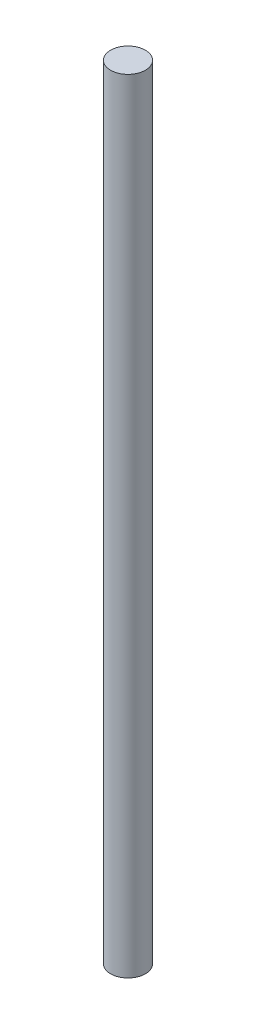
ISO-10303-21;
HEADER;
FILE_DESCRIPTION(('STEP AP214'),'2;1');
FILE_NAME('part.step','',(''),(''),'','','');
FILE_SCHEMA(('AUTOMOTIVE_DESIGN { 1 0 10303 214 1 1 1 1 }'));
ENDSEC;
DATA;
#1=APPLICATION_CONTEXT('core data for automotive mechanical design processes');
#2=APPLICATION_PROTOCOL_DEFINITION('international standard','automotive_design',2000,#1);
#3=PRODUCT_CONTEXT('',#1,'mechanical');
#4=PRODUCT('Part','Part','',(#3));
#5=PRODUCT_RELATED_PRODUCT_CATEGORY('part','',(#4));
#6=PRODUCT_DEFINITION_FORMATION('','',#4);
#7=PRODUCT_DEFINITION_CONTEXT('part definition',#1,'design');
#8=PRODUCT_DEFINITION('design','',#6,#7);
#9=PRODUCT_DEFINITION_SHAPE('','',#8);
#10=(LENGTH_UNIT() NAMED_UNIT(*) SI_UNIT(.MILLI.,.METRE.));
#11=(NAMED_UNIT(*) PLANE_ANGLE_UNIT() SI_UNIT($,.RADIAN.));
#12=(NAMED_UNIT(*) SI_UNIT($,.STERADIAN.) SOLID_ANGLE_UNIT());
#13=UNCERTAINTY_MEASURE_WITH_UNIT(LENGTH_MEASURE(1.E-05),#10,'distance_accuracy_value','');
#14=(GEOMETRIC_REPRESENTATION_CONTEXT(3) GLOBAL_UNCERTAINTY_ASSIGNED_CONTEXT((#13)) GLOBAL_UNIT_ASSIGNED_CONTEXT((#10,
#11,#12)) REPRESENTATION_CONTEXT('',''));
#15=CARTESIAN_POINT('',(0.,0.,0.));
#16=DIRECTION('',(0.,0.,1.));
#17=DIRECTION('',(1.,0.,0.));
#18=AXIS2_PLACEMENT_3D('',#15,#16,#17);
#19=CARTESIAN_POINT('',(0.,67.5,0.));
#20=DIRECTION('',(0.,-1.,0.));
#21=DIRECTION('',(0.,0.,-1.));
#22=AXIS2_PLACEMENT_3D('',#19,#20,#21);
#23=CYLINDRICAL_SURFACE('',#22,3.);
#24=CARTESIAN_POINT('',(0.,67.5,0.));
#25=DIRECTION('',(0.,1.,0.));
#26=DIRECTION('',(0.,0.,1.));
#27=AXIS2_PLACEMENT_3D('',#24,#25,#26);
#28=CIRCLE('',#27,3.);
#29=CARTESIAN_POINT('',(0.,67.5,3.));
#30=VERTEX_POINT('',#29);
#31=EDGE_CURVE('E10',#30,#30,#28,.T.);
#32=ORIENTED_EDGE('',*,*,#31,.F.);
#33=EDGE_LOOP('',(#32));
#34=FACE_BOUND('',#33,.T.);
#35=CARTESIAN_POINT('',(0.,-67.5,0.));
#36=DIRECTION('',(0.,1.,0.));
#37=DIRECTION('',(0.,0.,1.));
#38=AXIS2_PLACEMENT_3D('',#35,#36,#37);
#39=CIRCLE('',#38,3.);
#40=CARTESIAN_POINT('',(0.,-67.5,3.));
#41=VERTEX_POINT('',#40);
#42=EDGE_CURVE('E46',#41,#41,#39,.T.);
#43=ORIENTED_EDGE('',*,*,#42,.T.);
#44=EDGE_LOOP('',(#43));
#45=FACE_BOUND('',#44,.T.);
#46=ADVANCED_FACE('F43',(#34,#45),#23,.T.);
#47=CARTESIAN_POINT('',(0.,67.5,0.));
#48=DIRECTION('',(0.,1.,0.));
#49=DIRECTION('',(0.,0.,1.));
#50=AXIS2_PLACEMENT_3D('',#47,#48,#49);
#51=PLANE('',#50);
#52=ORIENTED_EDGE('',*,*,#31,.T.);
#53=EDGE_LOOP('',(#52));
#54=FACE_BOUND('',#53,.T.);
#55=ADVANCED_FACE('F60',(#54),#51,.T.);
#56=CARTESIAN_POINT('',(0.,-67.5,0.));
#57=DIRECTION('',(0.,1.,0.));
#58=DIRECTION('',(0.,0.,1.));
#59=AXIS2_PLACEMENT_3D('',#56,#57,#58);
#60=PLANE('',#59);
#61=ORIENTED_EDGE('',*,*,#42,.F.);
#62=EDGE_LOOP('',(#61));
#63=FACE_BOUND('',#62,.T.);
#64=ADVANCED_FACE('F58',(#63),#60,.F.);
#65=CLOSED_SHELL('',(#46,#55,#64));
#66=MANIFOLD_SOLID_BREP('B2',#65);
#67=ADVANCED_BREP_SHAPE_REPRESENTATION('',(#18,#66),#14);
#68=SHAPE_DEFINITION_REPRESENTATION(#9,#67);
ENDSEC;
END-ISO-10303-21;
